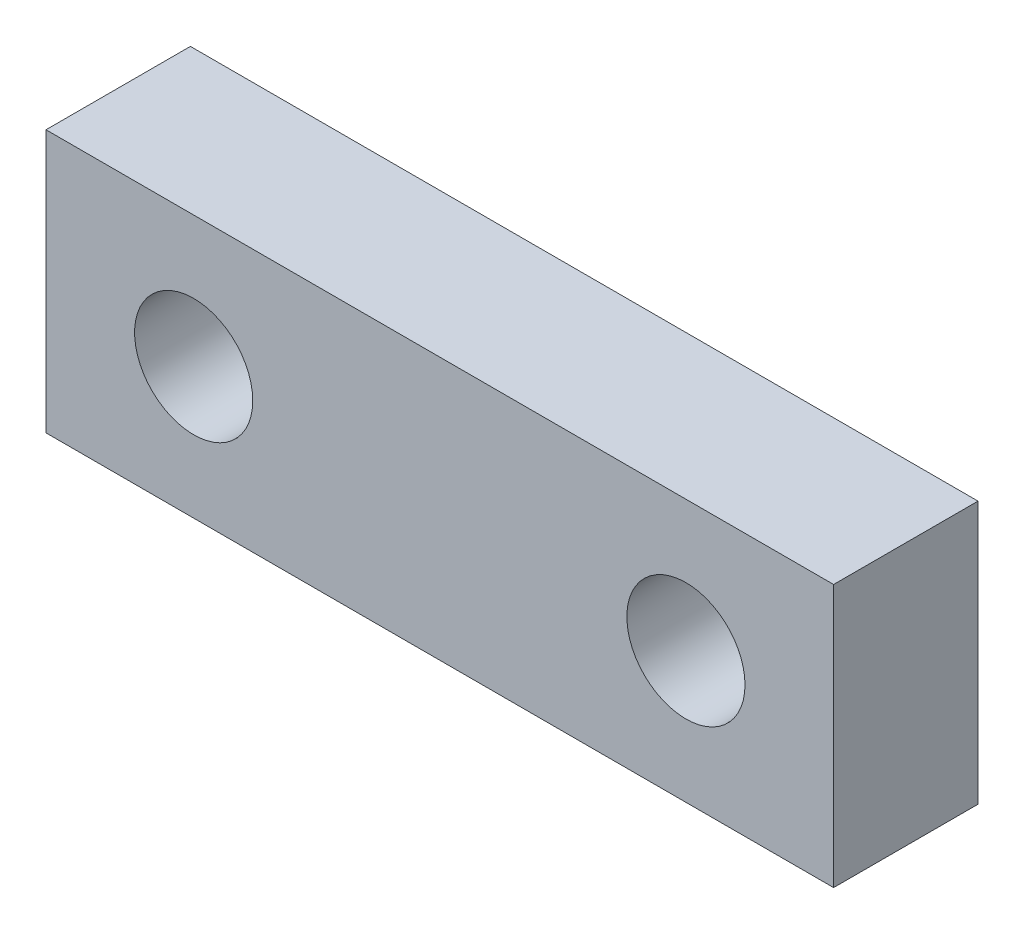
ISO-10303-21;
HEADER;
FILE_DESCRIPTION(('STEP AP214'),'2;1');
FILE_NAME('part.step','',(''),(''),'','','');
FILE_SCHEMA(('AUTOMOTIVE_DESIGN { 1 0 10303 214 1 1 1 1 }'));
ENDSEC;
DATA;
#1=APPLICATION_CONTEXT('core data for automotive mechanical design processes');
#2=APPLICATION_PROTOCOL_DEFINITION('international standard','automotive_design',2000,#1);
#3=PRODUCT_CONTEXT('',#1,'mechanical');
#4=PRODUCT('Part','Part','',(#3));
#5=PRODUCT_RELATED_PRODUCT_CATEGORY('part','',(#4));
#6=PRODUCT_DEFINITION_FORMATION('','',#4);
#7=PRODUCT_DEFINITION_CONTEXT('part definition',#1,'design');
#8=PRODUCT_DEFINITION('design','',#6,#7);
#9=PRODUCT_DEFINITION_SHAPE('','',#8);
#10=(LENGTH_UNIT() NAMED_UNIT(*) SI_UNIT(.MILLI.,.METRE.));
#11=(NAMED_UNIT(*) PLANE_ANGLE_UNIT() SI_UNIT($,.RADIAN.));
#12=(NAMED_UNIT(*) SI_UNIT($,.STERADIAN.) SOLID_ANGLE_UNIT());
#13=UNCERTAINTY_MEASURE_WITH_UNIT(LENGTH_MEASURE(1.E-05),#10,'distance_accuracy_value','');
#14=(GEOMETRIC_REPRESENTATION_CONTEXT(3) GLOBAL_UNCERTAINTY_ASSIGNED_CONTEXT((#13)) GLOBAL_UNIT_ASSIGNED_CONTEXT((#10,
#11,#12)) REPRESENTATION_CONTEXT('',''));
#15=CARTESIAN_POINT('',(0.,0.,0.));
#16=DIRECTION('',(0.,0.,1.));
#17=DIRECTION('',(1.,0.,0.));
#18=AXIS2_PLACEMENT_3D('',#15,#16,#17);
#19=CARTESIAN_POINT('',(0.,0.,0.));
#20=DIRECTION('',(0.,0.,-1.));
#21=DIRECTION('',(-1.,0.,0.));
#22=AXIS2_PLACEMENT_3D('',#19,#20,#21);
#23=PLANE('',#22);
#24=CARTESIAN_POINT('',(-9.375,0.,0.));
#25=DIRECTION('',(0.,0.,1.));
#26=DIRECTION('',(1.,0.,0.));
#27=AXIS2_PLACEMENT_3D('',#24,#25,#26);
#28=CIRCLE('',#27,3.5);
#29=CARTESIAN_POINT('',(-5.875,0.,0.));
#30=VERTEX_POINT('',#29);
#31=EDGE_CURVE('E110',#30,#30,#28,.T.);
#32=ORIENTED_EDGE('',*,*,#31,.T.);
#33=EDGE_LOOP('',(#32));
#34=FACE_BOUND('',#33,.T.);
#35=DIRECTION('',(0.,-1.,0.));
#36=VECTOR('',#35,1.);
#37=CARTESIAN_POINT('',(-15.,5.,0.));
#38=LINE('',#37,#36);
#39=CARTESIAN_POINT('',(-15.,5.,0.));
#40=VERTEX_POINT('',#39);
#41=CARTESIAN_POINT('',(-15.,-5.,0.));
#42=VERTEX_POINT('',#41);
#43=EDGE_CURVE('E79',#40,#42,#38,.T.);
#44=ORIENTED_EDGE('',*,*,#43,.F.);
#45=DIRECTION('',(-1.,0.,0.));
#46=VECTOR('',#45,1.);
#47=CARTESIAN_POINT('',(15.,5.,0.));
#48=LINE('',#47,#46);
#49=CARTESIAN_POINT('',(15.,5.,0.));
#50=VERTEX_POINT('',#49);
#51=EDGE_CURVE('E48',#50,#40,#48,.T.);
#52=ORIENTED_EDGE('',*,*,#51,.F.);
#53=DIRECTION('',(0.,1.,0.));
#54=VECTOR('',#53,1.);
#55=CARTESIAN_POINT('',(15.,5.,0.));
#56=LINE('',#55,#54);
#57=CARTESIAN_POINT('',(15.,-5.,0.));
#58=VERTEX_POINT('',#57);
#59=EDGE_CURVE('E56',#58,#50,#56,.T.);
#60=ORIENTED_EDGE('',*,*,#59,.F.);
#61=DIRECTION('',(1.,0.,0.));
#62=VECTOR('',#61,1.);
#63=CARTESIAN_POINT('',(15.,-5.,0.));
#64=LINE('',#63,#62);
#65=EDGE_CURVE('E116',#42,#58,#64,.T.);
#66=ORIENTED_EDGE('',*,*,#65,.F.);
#67=EDGE_LOOP('',(#44,#52,#60,#66));
#68=FACE_BOUND('',#67,.T.);
#69=CARTESIAN_POINT('',(9.375,0.,0.));
#70=DIRECTION('',(0.,0.,1.));
#71=DIRECTION('',(1.,0.,0.));
#72=AXIS2_PLACEMENT_3D('',#69,#70,#71);
#73=CIRCLE('',#72,3.5);
#74=CARTESIAN_POINT('',(12.875,0.,0.));
#75=VERTEX_POINT('',#74);
#76=EDGE_CURVE('E107',#75,#75,#73,.T.);
#77=ORIENTED_EDGE('',*,*,#76,.T.);
#78=EDGE_LOOP('',(#77));
#79=FACE_BOUND('',#78,.T.);
#80=ADVANCED_FACE('F33',(#34,#68,#79),#23,.T.);
#81=CARTESIAN_POINT('',(-15.,5.,1.5));
#82=DIRECTION('',(1.,0.,0.));
#83=DIRECTION('',(0.,1.,0.));
#84=AXIS2_PLACEMENT_3D('',#81,#82,#83);
#85=PLANE('',#84);
#86=ORIENTED_EDGE('',*,*,#43,.T.);
#87=DIRECTION('',(0.,0.,-1.));
#88=VECTOR('',#87,1.);
#89=CARTESIAN_POINT('',(-15.,-5.,1.5));
#90=LINE('',#89,#88);
#91=CARTESIAN_POINT('',(-15.,-5.,5.5));
#92=VERTEX_POINT('',#91);
#93=EDGE_CURVE('E11',#92,#42,#90,.T.);
#94=ORIENTED_EDGE('',*,*,#93,.F.);
#95=DIRECTION('',(0.,-1.,0.));
#96=VECTOR('',#95,1.);
#97=CARTESIAN_POINT('',(-15.,-5.,5.5));
#98=LINE('',#97,#96);
#99=CARTESIAN_POINT('',(-15.,5.,5.5));
#100=VERTEX_POINT('',#99);
#101=EDGE_CURVE('E77',#100,#92,#98,.T.);
#102=ORIENTED_EDGE('',*,*,#101,.F.);
#103=DIRECTION('',(0.,0.,-1.));
#104=VECTOR('',#103,1.);
#105=CARTESIAN_POINT('',(-15.,5.,1.5));
#106=LINE('',#105,#104);
#107=EDGE_CURVE('E120',#100,#40,#106,.T.);
#108=ORIENTED_EDGE('',*,*,#107,.T.);
#109=EDGE_LOOP('',(#86,#94,#102,#108));
#110=FACE_BOUND('',#109,.T.);
#111=ADVANCED_FACE('F35',(#110),#85,.F.);
#112=CARTESIAN_POINT('',(15.,-5.,1.5));
#113=DIRECTION('',(0.,1.,0.));
#114=DIRECTION('',(-1.,0.,0.));
#115=AXIS2_PLACEMENT_3D('',#112,#113,#114);
#116=PLANE('',#115);
#117=ORIENTED_EDGE('',*,*,#65,.T.);
#118=DIRECTION('',(0.,0.,-1.));
#119=VECTOR('',#118,1.);
#120=CARTESIAN_POINT('',(15.,-5.,1.5));
#121=LINE('',#120,#119);
#122=CARTESIAN_POINT('',(15.,-5.,5.5));
#123=VERTEX_POINT('',#122);
#124=EDGE_CURVE('E41',#123,#58,#121,.T.);
#125=ORIENTED_EDGE('',*,*,#124,.F.);
#126=DIRECTION('',(1.,0.,0.));
#127=VECTOR('',#126,1.);
#128=CARTESIAN_POINT('',(15.,-5.,5.5));
#129=LINE('',#128,#127);
#130=EDGE_CURVE('E82',#92,#123,#129,.T.);
#131=ORIENTED_EDGE('',*,*,#130,.F.);
#132=ORIENTED_EDGE('',*,*,#93,.T.);
#133=EDGE_LOOP('',(#117,#125,#131,#132));
#134=FACE_BOUND('',#133,.T.);
#135=ADVANCED_FACE('F83',(#134),#116,.F.);
#136=CARTESIAN_POINT('',(15.,5.,1.5));
#137=DIRECTION('',(-1.,0.,0.));
#138=DIRECTION('',(0.,-1.,0.));
#139=AXIS2_PLACEMENT_3D('',#136,#137,#138);
#140=PLANE('',#139);
#141=ORIENTED_EDGE('',*,*,#59,.T.);
#142=DIRECTION('',(0.,0.,-1.));
#143=VECTOR('',#142,1.);
#144=CARTESIAN_POINT('',(15.,5.,1.5));
#145=LINE('',#144,#143);
#146=CARTESIAN_POINT('',(15.,5.,5.5));
#147=VERTEX_POINT('',#146);
#148=EDGE_CURVE('E122',#147,#50,#145,.T.);
#149=ORIENTED_EDGE('',*,*,#148,.F.);
#150=DIRECTION('',(0.,1.,0.));
#151=VECTOR('',#150,1.);
#152=CARTESIAN_POINT('',(15.,-5.,5.5));
#153=LINE('',#152,#151);
#154=EDGE_CURVE('E87',#123,#147,#153,.T.);
#155=ORIENTED_EDGE('',*,*,#154,.F.);
#156=ORIENTED_EDGE('',*,*,#124,.T.);
#157=EDGE_LOOP('',(#141,#149,#155,#156));
#158=FACE_BOUND('',#157,.T.);
#159=ADVANCED_FACE('F123',(#158),#140,.F.);
#160=CARTESIAN_POINT('',(15.,5.,1.5));
#161=DIRECTION('',(0.,-1.,0.));
#162=DIRECTION('',(1.,0.,0.));
#163=AXIS2_PLACEMENT_3D('',#160,#161,#162);
#164=PLANE('',#163);
#165=ORIENTED_EDGE('',*,*,#51,.T.);
#166=ORIENTED_EDGE('',*,*,#107,.F.);
#167=DIRECTION('',(-1.,0.,0.));
#168=VECTOR('',#167,1.);
#169=CARTESIAN_POINT('',(15.,5.,5.5));
#170=LINE('',#169,#168);
#171=EDGE_CURVE('E93',#147,#100,#170,.T.);
#172=ORIENTED_EDGE('',*,*,#171,.F.);
#173=ORIENTED_EDGE('',*,*,#148,.T.);
#174=EDGE_LOOP('',(#165,#166,#172,#173));
#175=FACE_BOUND('',#174,.T.);
#176=ADVANCED_FACE('F144',(#175),#164,.F.);
#177=CARTESIAN_POINT('',(-9.375,0.,1.5));
#178=DIRECTION('',(0.,0.,-1.));
#179=DIRECTION('',(-1.,0.,0.));
#180=AXIS2_PLACEMENT_3D('',#177,#178,#179);
#181=CYLINDRICAL_SURFACE('',#180,3.5);
#182=CARTESIAN_POINT('',(-9.375,0.,1.5));
#183=DIRECTION('',(0.,0.,1.));
#184=DIRECTION('',(1.,0.,0.));
#185=AXIS2_PLACEMENT_3D('',#182,#183,#184);
#186=CIRCLE('',#185,3.5);
#187=CARTESIAN_POINT('',(-5.875,0.,1.5));
#188=VERTEX_POINT('',#187);
#189=EDGE_CURVE('E106',#188,#188,#186,.T.);
#190=ORIENTED_EDGE('',*,*,#189,.T.);
#191=EDGE_LOOP('',(#190));
#192=FACE_BOUND('',#191,.T.);
#193=ORIENTED_EDGE('',*,*,#31,.F.);
#194=EDGE_LOOP('',(#193));
#195=FACE_BOUND('',#194,.T.);
#196=ADVANCED_FACE('F134',(#192,#195),#181,.F.);
#197=CARTESIAN_POINT('',(9.375,0.,1.5));
#198=DIRECTION('',(0.,0.,-1.));
#199=DIRECTION('',(-1.,0.,0.));
#200=AXIS2_PLACEMENT_3D('',#197,#198,#199);
#201=CYLINDRICAL_SURFACE('',#200,3.5);
#202=CARTESIAN_POINT('',(9.375,0.,1.5));
#203=DIRECTION('',(0.,0.,1.));
#204=DIRECTION('',(1.,0.,0.));
#205=AXIS2_PLACEMENT_3D('',#202,#203,#204);
#206=CIRCLE('',#205,3.5);
#207=CARTESIAN_POINT('',(12.875,0.,1.5));
#208=VERTEX_POINT('',#207);
#209=EDGE_CURVE('E103',#208,#208,#206,.T.);
#210=ORIENTED_EDGE('',*,*,#209,.T.);
#211=EDGE_LOOP('',(#210));
#212=FACE_BOUND('',#211,.T.);
#213=ORIENTED_EDGE('',*,*,#76,.F.);
#214=EDGE_LOOP('',(#213));
#215=FACE_BOUND('',#214,.T.);
#216=ADVANCED_FACE('F131',(#212,#215),#201,.F.);
#217=CARTESIAN_POINT('',(0.,0.,1.5));
#218=DIRECTION('',(0.,0.,1.));
#219=DIRECTION('',(1.,0.,0.));
#220=AXIS2_PLACEMENT_3D('',#217,#218,#219);
#221=PLANE('',#220);
#222=CARTESIAN_POINT('',(-9.375,0.,1.5));
#223=DIRECTION('',(0.,0.,1.));
#224=DIRECTION('',(1.,0.,0.));
#225=AXIS2_PLACEMENT_3D('',#222,#223,#224);
#226=CIRCLE('',#225,2.25);
#227=CARTESIAN_POINT('',(-7.125,0.,1.5));
#228=VERTEX_POINT('',#227);
#229=EDGE_CURVE('E97',#228,#228,#226,.T.);
#230=ORIENTED_EDGE('',*,*,#229,.T.);
#231=EDGE_LOOP('',(#230));
#232=FACE_BOUND('',#231,.T.);
#233=ORIENTED_EDGE('',*,*,#189,.F.);
#234=EDGE_LOOP('',(#233));
#235=FACE_BOUND('',#234,.T.);
#236=ADVANCED_FACE('F133',(#232,#235),#221,.F.);
#237=CARTESIAN_POINT('',(9.375,0.,1.5));
#238=DIRECTION('',(0.,0.,1.));
#239=DIRECTION('',(1.,0.,0.));
#240=AXIS2_PLACEMENT_3D('',#237,#238,#239);
#241=CIRCLE('',#240,2.25);
#242=CARTESIAN_POINT('',(11.625,0.,1.5));
#243=VERTEX_POINT('',#242);
#244=EDGE_CURVE('E252',#243,#243,#241,.T.);
#245=ORIENTED_EDGE('',*,*,#244,.T.);
#246=EDGE_LOOP('',(#245));
#247=FACE_BOUND('',#246,.T.);
#248=ORIENTED_EDGE('',*,*,#209,.F.);
#249=EDGE_LOOP('',(#248));
#250=FACE_BOUND('',#249,.T.);
#251=ADVANCED_FACE('F141',(#247,#250),#221,.F.);
#252=CARTESIAN_POINT('',(0.,0.,5.5));
#253=DIRECTION('',(0.,0.,1.));
#254=DIRECTION('',(1.,0.,0.));
#255=AXIS2_PLACEMENT_3D('',#252,#253,#254);
#256=PLANE('',#255);
#257=CARTESIAN_POINT('',(-9.375,0.,5.5));
#258=DIRECTION('',(0.,0.,1.));
#259=DIRECTION('',(1.,0.,0.));
#260=AXIS2_PLACEMENT_3D('',#257,#258,#259);
#261=CIRCLE('',#260,2.25);
#262=CARTESIAN_POINT('',(-7.125,0.,5.5));
#263=VERTEX_POINT('',#262);
#264=EDGE_CURVE('E94',#263,#263,#261,.T.);
#265=ORIENTED_EDGE('',*,*,#264,.F.);
#266=EDGE_LOOP('',(#265));
#267=FACE_BOUND('',#266,.T.);
#268=ORIENTED_EDGE('',*,*,#101,.T.);
#269=ORIENTED_EDGE('',*,*,#130,.T.);
#270=ORIENTED_EDGE('',*,*,#154,.T.);
#271=ORIENTED_EDGE('',*,*,#171,.T.);
#272=EDGE_LOOP('',(#268,#269,#270,#271));
#273=FACE_BOUND('',#272,.T.);
#274=CARTESIAN_POINT('',(9.375,0.,5.5));
#275=DIRECTION('',(0.,0.,1.));
#276=DIRECTION('',(1.,0.,0.));
#277=AXIS2_PLACEMENT_3D('',#274,#275,#276);
#278=CIRCLE('',#277,2.25);
#279=CARTESIAN_POINT('',(11.625,0.,5.5));
#280=VERTEX_POINT('',#279);
#281=EDGE_CURVE('E249',#280,#280,#278,.T.);
#282=ORIENTED_EDGE('',*,*,#281,.F.);
#283=EDGE_LOOP('',(#282));
#284=FACE_BOUND('',#283,.T.);
#285=ADVANCED_FACE('F90',(#267,#273,#284),#256,.T.);
#286=CARTESIAN_POINT('',(-9.375,0.,5.5));
#287=DIRECTION('',(0.,0.,-1.));
#288=DIRECTION('',(-1.,0.,0.));
#289=AXIS2_PLACEMENT_3D('',#286,#287,#288);
#290=CYLINDRICAL_SURFACE('',#289,2.25);
#291=ORIENTED_EDGE('',*,*,#264,.T.);
#292=EDGE_LOOP('',(#291));
#293=FACE_BOUND('',#292,.T.);
#294=ORIENTED_EDGE('',*,*,#229,.F.);
#295=EDGE_LOOP('',(#294));
#296=FACE_BOUND('',#295,.T.);
#297=ADVANCED_FACE('F222',(#293,#296),#290,.F.);
#298=CARTESIAN_POINT('',(9.375,0.,5.5));
#299=DIRECTION('',(0.,0.,-1.));
#300=DIRECTION('',(-1.,0.,0.));
#301=AXIS2_PLACEMENT_3D('',#298,#299,#300);
#302=CYLINDRICAL_SURFACE('',#301,2.25);
#303=ORIENTED_EDGE('',*,*,#281,.T.);
#304=EDGE_LOOP('',(#303));
#305=FACE_BOUND('',#304,.T.);
#306=ORIENTED_EDGE('',*,*,#244,.F.);
#307=EDGE_LOOP('',(#306));
#308=FACE_BOUND('',#307,.T.);
#309=ADVANCED_FACE('F230',(#305,#308),#302,.F.);
#310=CLOSED_SHELL('',(#80,#111,#135,#159,#176,#196,#216,#236,#251,#285,#297,#309));
#311=MANIFOLD_SOLID_BREP('B2',#310);
#312=ADVANCED_BREP_SHAPE_REPRESENTATION('',(#18,#311),#14);
#313=SHAPE_DEFINITION_REPRESENTATION(#9,#312);
ENDSEC;
END-ISO-10303-21;
